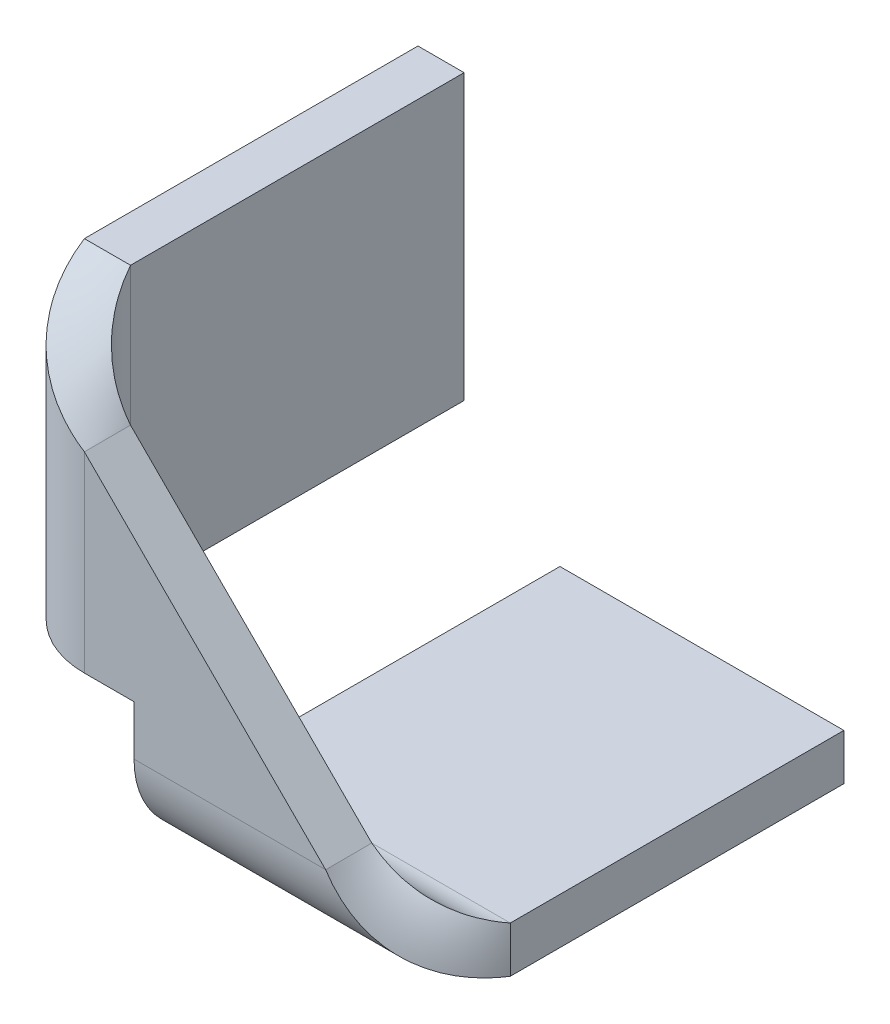
ISO-10303-21;
HEADER;
FILE_DESCRIPTION(('STEP AP214'),'2;1');
FILE_NAME('part.step','',(''),(''),'','','');
FILE_SCHEMA(('AUTOMOTIVE_DESIGN { 1 0 10303 214 1 1 1 1 }'));
ENDSEC;
DATA;
#1=APPLICATION_CONTEXT('core data for automotive mechanical design processes');
#2=APPLICATION_PROTOCOL_DEFINITION('international standard','automotive_design',2000,#1);
#3=PRODUCT_CONTEXT('',#1,'mechanical');
#4=PRODUCT('Part','Part','',(#3));
#5=PRODUCT_RELATED_PRODUCT_CATEGORY('part','',(#4));
#6=PRODUCT_DEFINITION_FORMATION('','',#4);
#7=PRODUCT_DEFINITION_CONTEXT('part definition',#1,'design');
#8=PRODUCT_DEFINITION('design','',#6,#7);
#9=PRODUCT_DEFINITION_SHAPE('','',#8);
#10=(LENGTH_UNIT() NAMED_UNIT(*) SI_UNIT(.MILLI.,.METRE.));
#11=(NAMED_UNIT(*) PLANE_ANGLE_UNIT() SI_UNIT($,.RADIAN.));
#12=(NAMED_UNIT(*) SI_UNIT($,.STERADIAN.) SOLID_ANGLE_UNIT());
#13=UNCERTAINTY_MEASURE_WITH_UNIT(LENGTH_MEASURE(1.E-05),#10,'distance_accuracy_value','');
#14=(GEOMETRIC_REPRESENTATION_CONTEXT(3) GLOBAL_UNCERTAINTY_ASSIGNED_CONTEXT((#13)) GLOBAL_UNIT_ASSIGNED_CONTEXT((#10,
#11,#12)) REPRESENTATION_CONTEXT('',''));
#15=CARTESIAN_POINT('',(0.,0.,0.));
#16=DIRECTION('',(0.,0.,1.));
#17=DIRECTION('',(1.,0.,0.));
#18=AXIS2_PLACEMENT_3D('',#15,#16,#17);
#19=CARTESIAN_POINT('',(9.19,0.,-0.8128));
#20=DIRECTION('',(0.707106781186547,0.707106781186548,0.));
#21=DIRECTION('',(-0.707106781186548,0.707106781186547,0.));
#22=AXIS2_PLACEMENT_3D('',#19,#20,#21);
#23=PLANE('',#22);
#24=DIRECTION('',(-0.707106781186548,0.707106781186547,0.));
#25=VECTOR('',#24,1.);
#26=CARTESIAN_POINT('',(9.19,0.,-0.8128));
#27=LINE('',#26,#25);
#28=CARTESIAN_POINT('',(7.5644,1.6256,-0.8128));
#29=VERTEX_POINT('',#28);
#30=CARTESIAN_POINT('',(3.31559999999999,5.87440000000001,-0.8128));
#31=VERTEX_POINT('',#30);
#32=EDGE_CURVE('E99',#29,#31,#27,.T.);
#33=ORIENTED_EDGE('',*,*,#32,.T.);
#34=DIRECTION('',(0.,0.,1.));
#35=VECTOR('',#34,1.);
#36=CARTESIAN_POINT('',(3.31559999999999,5.87440000000001,-0.8128));
#37=LINE('',#36,#35);
#38=CARTESIAN_POINT('',(3.31559999999999,5.87440000000001,0.));
#39=VERTEX_POINT('',#38);
#40=EDGE_CURVE('E244',#31,#39,#37,.T.);
#41=ORIENTED_EDGE('',*,*,#40,.T.);
#42=DIRECTION('',(-0.707106781186548,0.707106781186547,0.));
#43=VECTOR('',#42,1.);
#44=CARTESIAN_POINT('',(9.19,0.,0.));
#45=LINE('',#44,#43);
#46=CARTESIAN_POINT('',(7.5644,1.6256,0.));
#47=VERTEX_POINT('',#46);
#48=EDGE_CURVE('E345',#47,#39,#45,.T.);
#49=ORIENTED_EDGE('',*,*,#48,.F.);
#50=DIRECTION('',(0.,0.,1.));
#51=VECTOR('',#50,1.);
#52=CARTESIAN_POINT('',(7.5644,1.6256,-0.8128));
#53=LINE('',#52,#51);
#54=EDGE_CURVE('E353',#29,#47,#53,.T.);
#55=ORIENTED_EDGE('',*,*,#54,.F.);
#56=EDGE_LOOP('',(#33,#41,#49,#55));
#57=FACE_BOUND('',#56,.T.);
#58=ADVANCED_FACE('F90',(#57),#23,.T.);
#59=CARTESIAN_POINT('',(0.,0.,-0.8128));
#60=DIRECTION('',(0.,0.,1.));
#61=DIRECTION('',(1.,0.,0.));
#62=AXIS2_PLACEMENT_3D('',#59,#60,#61);
#63=PLANE('',#62);
#64=DIRECTION('',(0.,1.,0.));
#65=VECTOR('',#64,1.);
#66=CARTESIAN_POINT('',(3.31559999999999,7.5,-0.8128));
#67=LINE('',#66,#65);
#68=CARTESIAN_POINT('',(3.31559999999999,2.5,-0.8128));
#69=VERTEX_POINT('',#68);
#70=EDGE_CURVE('E251',#31,#69,#67,.F.);
#71=ORIENTED_EDGE('',*,*,#70,.F.);
#72=ORIENTED_EDGE('',*,*,#32,.F.);
#73=DIRECTION('',(-1.,0.,0.));
#74=VECTOR('',#73,1.);
#75=CARTESIAN_POINT('',(4.19,1.6256,-0.8128));
#76=LINE('',#75,#74);
#77=CARTESIAN_POINT('',(4.19,1.6256,-0.8128));
#78=VERTEX_POINT('',#77);
#79=EDGE_CURVE('E369',#78,#29,#76,.F.);
#80=ORIENTED_EDGE('',*,*,#79,.F.);
#81=DIRECTION('',(0.,-1.,0.));
#82=VECTOR('',#81,1.);
#83=CARTESIAN_POINT('',(4.19,0.,-0.8128));
#84=LINE('',#83,#82);
#85=CARTESIAN_POINT('',(4.19,2.5,-0.8128));
#86=VERTEX_POINT('',#85);
#87=EDGE_CURVE('E335',#86,#78,#84,.T.);
#88=ORIENTED_EDGE('',*,*,#87,.F.);
#89=DIRECTION('',(1.,0.,0.));
#90=VECTOR('',#89,1.);
#91=CARTESIAN_POINT('',(4.19,2.5,-0.8128));
#92=LINE('',#91,#90);
#93=EDGE_CURVE('E114',#69,#86,#92,.T.);
#94=ORIENTED_EDGE('',*,*,#93,.F.);
#95=EDGE_LOOP('',(#71,#72,#80,#88,#94));
#96=FACE_BOUND('',#95,.T.);
#97=ADVANCED_FACE('F312',(#96),#63,.F.);
#98=CARTESIAN_POINT('',(0.,0.,0.));
#99=DIRECTION('',(0.,0.,1.));
#100=DIRECTION('',(1.,0.,0.));
#101=AXIS2_PLACEMENT_3D('',#98,#99,#100);
#102=PLANE('',#101);
#103=ORIENTED_EDGE('',*,*,#48,.T.);
#104=DIRECTION('',(0.,1.,0.));
#105=VECTOR('',#104,1.);
#106=CARTESIAN_POINT('',(3.31559999999999,7.5,0.));
#107=LINE('',#106,#105);
#108=CARTESIAN_POINT('',(3.31559999999999,2.5,0.));
#109=VERTEX_POINT('',#108);
#110=EDGE_CURVE('E245',#39,#109,#107,.F.);
#111=ORIENTED_EDGE('',*,*,#110,.T.);
#112=DIRECTION('',(1.,0.,0.));
#113=VECTOR('',#112,1.);
#114=CARTESIAN_POINT('',(4.19,2.5,0.));
#115=LINE('',#114,#113);
#116=CARTESIAN_POINT('',(4.19,2.5,0.));
#117=VERTEX_POINT('',#116);
#118=EDGE_CURVE('E349',#109,#117,#115,.T.);
#119=ORIENTED_EDGE('',*,*,#118,.T.);
#120=DIRECTION('',(0.,-1.,0.));
#121=VECTOR('',#120,1.);
#122=CARTESIAN_POINT('',(4.19,0.,0.));
#123=LINE('',#122,#121);
#124=CARTESIAN_POINT('',(4.19,1.6256,0.));
#125=VERTEX_POINT('',#124);
#126=EDGE_CURVE('E352',#117,#125,#123,.T.);
#127=ORIENTED_EDGE('',*,*,#126,.T.);
#128=DIRECTION('',(-1.,0.,0.));
#129=VECTOR('',#128,1.);
#130=CARTESIAN_POINT('',(4.19,1.6256,0.));
#131=LINE('',#130,#129);
#132=EDGE_CURVE('E359',#125,#47,#131,.F.);
#133=ORIENTED_EDGE('',*,*,#132,.T.);
#134=EDGE_LOOP('',(#103,#111,#119,#127,#133));
#135=FACE_BOUND('',#134,.T.);
#136=ADVANCED_FACE('F318',(#135),#102,.T.);
#137=CARTESIAN_POINT('',(4.19,0.,-0.8128));
#138=DIRECTION('',(-1.,0.,0.));
#139=DIRECTION('',(0.,0.,1.));
#140=AXIS2_PLACEMENT_3D('',#137,#138,#139);
#141=PLANE('',#140);
#142=ORIENTED_EDGE('',*,*,#87,.T.);
#143=DIRECTION('',(0.,0.,1.));
#144=VECTOR('',#143,1.);
#145=CARTESIAN_POINT('',(4.19,1.6256,-0.8128));
#146=LINE('',#145,#144);
#147=EDGE_CURVE('E337',#78,#125,#146,.T.);
#148=ORIENTED_EDGE('',*,*,#147,.T.);
#149=ORIENTED_EDGE('',*,*,#126,.F.);
#150=DIRECTION('',(0.,0.,1.));
#151=VECTOR('',#150,1.);
#152=CARTESIAN_POINT('',(4.19,2.5,-0.8128));
#153=LINE('',#152,#151);
#154=EDGE_CURVE('E13',#86,#117,#153,.T.);
#155=ORIENTED_EDGE('',*,*,#154,.F.);
#156=EDGE_LOOP('',(#142,#148,#149,#155));
#157=FACE_BOUND('',#156,.T.);
#158=ADVANCED_FACE('F323',(#157),#141,.T.);
#159=CARTESIAN_POINT('',(4.19,2.5,-0.8128));
#160=DIRECTION('',(0.,-1.,0.));
#161=DIRECTION('',(0.,0.,-1.));
#162=AXIS2_PLACEMENT_3D('',#159,#160,#161);
#163=PLANE('',#162);
#164=DIRECTION('',(0.,0.,1.));
#165=VECTOR('',#164,1.);
#166=CARTESIAN_POINT('',(3.31559999999999,2.5,-0.8128));
#167=LINE('',#166,#165);
#168=EDGE_CURVE('E258',#69,#109,#167,.T.);
#169=ORIENTED_EDGE('',*,*,#168,.F.);
#170=ORIENTED_EDGE('',*,*,#93,.T.);
#171=ORIENTED_EDGE('',*,*,#154,.T.);
#172=ORIENTED_EDGE('',*,*,#118,.F.);
#173=EDGE_LOOP('',(#169,#170,#171,#172));
#174=FACE_BOUND('',#173,.T.);
#175=ADVANCED_FACE('F92',(#174),#163,.T.);
#176=CARTESIAN_POINT('',(7.5644,1.6256,0.00812800000000044));
#177=CARTESIAN_POINT('',(7.69988412758838,1.41171800414825,0.00812800000000044));
#178=CARTESIAN_POINT('',(7.83533333333333,1.19797515238148,-0.0343935668920254));
#179=CARTESIAN_POINT('',(8.10626666666667,0.80282357043661,-0.198070711326774));
#180=CARTESIAN_POINT('',(8.24173333333333,0.621597816268821,-0.319161888902504));
#181=CARTESIAN_POINT('',(8.51266666666667,0.319161888902505,-0.621597816268819));
#182=CARTESIAN_POINT('',(8.64813333333333,0.198070711326774,-0.802823570436608));
#183=CARTESIAN_POINT('',(8.91906666666667,0.0343935668920247,-1.19797515238148));
#184=CARTESIAN_POINT('',(9.05451587241162,-0.00812800000000207,-1.41171800414824));
#185=CARTESIAN_POINT('',(9.19,-0.00812800000000282,-1.62559999999999));
#186=CARTESIAN_POINT('',(7.5644,1.6256,0.));
#187=CARTESIAN_POINT('',(7.69988404696728,1.41278215668449,0.));
#188=CARTESIAN_POINT('',(7.83533333333333,1.20010263918555,-0.0423100168079855));
#189=CARTESIAN_POINT('',(8.10626666666667,0.806916985509065,-0.205172847091317));
#190=CARTESIAN_POINT('',(8.24173333333333,0.626592852008777,-0.325661580997516));
#191=CARTESIAN_POINT('',(8.51266666666667,0.325661580997518,-0.626592852008775));
#192=CARTESIAN_POINT('',(8.64813333333333,0.205172847091318,-0.806916985509062));
#193=CARTESIAN_POINT('',(8.91906666666667,0.0423100168079847,-1.20010263918555));
#194=CARTESIAN_POINT('',(9.05451595303273,0.,-1.41278215668449));
#195=CARTESIAN_POINT('',(9.19,0.,-1.62559999999999));
#196=CARTESIAN_POINT('',(7.5644,1.6256,-0.8128));
#197=CARTESIAN_POINT('',(7.69987598485685,1.51919741030897,-0.8128));
#198=CARTESIAN_POINT('',(7.83533333333333,1.41285131959278,-0.833955008403993));
#199=CARTESIAN_POINT('',(8.10626666666667,1.21625849275453,-0.915386423545658));
#200=CARTESIAN_POINT('',(8.24173333333333,1.12609642600439,-0.975630790498758));
#201=CARTESIAN_POINT('',(8.51266666666667,0.975630790498757,-1.12609642600439));
#202=CARTESIAN_POINT('',(8.64813333333333,0.915386423545657,-1.21625849275453));
#203=CARTESIAN_POINT('',(8.91906666666667,0.833955008403991,-1.41285131959277));
#204=CARTESIAN_POINT('',(9.05452401514315,0.812799999999998,-1.51919741030897));
#205=CARTESIAN_POINT('',(9.19,0.812799999999997,-1.6256));
#206=CARTESIAN_POINT('',(7.5644,1.6256,-0.82100928));
#207=CARTESIAN_POINT('',(7.69987590342953,1.52027220437058,-0.82100928));
#208=CARTESIAN_POINT('',(7.83533333333333,1.41500008126489,-0.841950622819112));
#209=CARTESIAN_POINT('',(8.10626666666667,1.22039284197771,-0.922559580667847));
#210=CARTESIAN_POINT('',(8.24173333333333,1.13114141210174,-0.982195479514721));
#211=CARTESIAN_POINT('',(8.51266666666667,0.98219547951472,-1.13114141210174));
#212=CARTESIAN_POINT('',(8.64813333333333,0.922559580667846,-1.22039284197771));
#213=CARTESIAN_POINT('',(8.91906666666667,0.841950622819111,-1.41500008126489));
#214=CARTESIAN_POINT('',(9.05452409657046,0.821009279999998,-1.52027220437057));
#215=CARTESIAN_POINT('',(9.19,0.821009279999997,-1.6256));
#216=B_SPLINE_SURFACE_WITH_KNOTS('',1,3,((#176,#177,#178,#179,#180,#181,#182,#183,#184,#185),
(#186,#187,#188,#189,#190,#191,#192,#193,#194,#195),(#196,#197,#198,#199,#200,#201,#202,#203,
#204,#205),(#206,#207,#208,#209,#210,#211,#212,#213,#214,#215)),.UNSPECIFIED.,.F.,.F.,.F.,(2,1,
1,2),(4,2,2,2,4),(-0.01,0.,1.,1.0101),(0.,0.25,0.5,0.75,1.),.UNSPECIFIED.);
#217=DIRECTION('',(0.,1.,0.));
#218=VECTOR('',#217,1.);
#219=CARTESIAN_POINT('',(9.19,0.,-1.62559999999999));
#220=LINE('',#219,#218);
#221=CARTESIAN_POINT('',(9.19,0.812799999999997,-1.6256));
#222=VERTEX_POINT('',#221);
#223=CARTESIAN_POINT('',(9.19,0.,-1.62559999999999));
#224=VERTEX_POINT('',#223);
#225=EDGE_CURVE('E262',#222,#224,#220,.F.);
#226=CARTESIAN_POINT('',(7.5644,1.6256,-0.8128));
#227=CARTESIAN_POINT('',(7.61166338937327,1.58848120839972,-0.812783326548156));
#228=CARTESIAN_POINT('',(7.65892337579554,1.55136456050474,-0.815342088576877));
#229=CARTESIAN_POINT('',(7.75343654696838,1.47782796806991,-0.825488995568115));
#230=CARTESIAN_POINT('',(7.80068973184159,1.44140793854422,-0.833076522954139));
#231=CARTESIAN_POINT('',(7.89504357068617,1.3700665090968,-0.853126094852786));
#232=CARTESIAN_POINT('',(7.94214420868173,1.3351405232327,-0.865571825580327));
#233=CARTESIAN_POINT('',(8.03633131067102,1.2673124589663,-0.895090463806872));
#234=CARTESIAN_POINT('',(8.08341777514003,1.2344103028119,-0.912163193408059));
#235=CARTESIAN_POINT('',(8.22518100772179,1.1393269164824,-0.970091485619775));
#236=CARTESIAN_POINT('',(8.31992405705843,1.08111150781891,-1.0175592425017));
#237=CARTESIAN_POINT('',(8.50938057480472,0.979779348495315,-1.12650955307725));
#238=CARTESIAN_POINT('',(8.60409404128916,0.936657056731869,-1.18798694972732));
#239=CARTESIAN_POINT('',(8.73961465556353,0.887991765317754,-1.28264537286954));
#240=CARTESIAN_POINT('',(8.78050287628679,0.875011954038179,-1.312079450878));
#241=CARTESIAN_POINT('',(8.86228563928151,0.852617646202696,-1.37227965665929));
#242=CARTESIAN_POINT('',(8.9031801807327,0.843202850047989,-1.40304567225572));
#243=CARTESIAN_POINT('',(8.98505789471957,0.828064775922369,-1.46554609840697));
#244=CARTESIAN_POINT('',(9.02604105892291,0.822349879763522,-1.49728253837125));
#245=CARTESIAN_POINT('',(9.10801521021243,0.814712542118944,-1.5612124009258));
#246=CARTESIAN_POINT('',(9.14900619745971,0.81279073564452,-1.59340589912494));
#247=CARTESIAN_POINT('',(9.19,0.812799999999997,-1.6256));
#248=B_SPLINE_CURVE_WITH_KNOTS('',3,(#226,#227,#228,#229,#230,#231,#232,#233,#234,#235,#236,
#237,#238,#239,#240,#241,#242,#243,#244,#245,#246,#247),.UNSPECIFIED.,.F.,.F.,(4,2,2,2,2,2,2,2,
2,2,4),(0.,0.180229608899156,0.360437088121845,0.540044567704543,0.719645142758519,
1.08051758874071,1.44125740909242,1.59722557168485,1.75318062402431,1.90948775446224,
2.06582105047687),.UNSPECIFIED.);
#249=EDGE_CURVE('E375',#29,#222,#248,.T.);
#250=CARTESIAN_POINT('',(7.5644,1.6256,0.));
#251=CARTESIAN_POINT('',(7.59891739987242,1.57138347869436,8.95556154438632E-06));
#252=CARTESIAN_POINT('',(7.63343228780956,1.51716926247434,-0.00271219154217898));
#253=CARTESIAN_POINT('',(7.7024583729108,1.40928495325419,-0.0135470645411389));
#254=CARTESIAN_POINT('',(7.73696957016728,1.35561482405513,-0.0216604292615984));
#255=CARTESIAN_POINT('',(7.80597214396022,1.24938479714437,-0.0432052319686749));
#256=CARTESIAN_POINT('',(7.84046351904778,1.19682421093681,-0.0566332634181364));
#257=CARTESIAN_POINT('',(7.90943844013843,1.09331967631916,-0.0886574352658036));
#258=CARTESIAN_POINT('',(7.94392198626144,1.04237570122001,-0.107253490294213));
#259=CARTESIAN_POINT('',(8.04747005947011,0.892575944085228,-0.170613842791386));
#260=CARTESIAN_POINT('',(8.11658613850283,0.796824347285647,-0.22293560465262));
#261=CARTESIAN_POINT('',(8.25474785675975,0.617743836128655,-0.345526055647164));
#262=CARTESIAN_POINT('',(8.32379351391378,0.534408811848525,-0.41578587136262));
#263=CARTESIAN_POINT('',(8.46189788431638,0.383354102768654,-0.571485506163266));
#264=CARTESIAN_POINT('',(8.53095659806655,0.315635255670388,-0.656926139160766));
#265=CARTESIAN_POINT('',(8.66909760323248,0.198520674238566,-0.839596907783758));
#266=CARTESIAN_POINT('',(8.73817989313652,0.149132217659907,-0.936831705786897));
#267=CARTESIAN_POINT('',(8.87107136539665,0.073684925791739,-1.13146143486428));
#268=CARTESIAN_POINT('',(8.9348798222591,0.0461309104563841,-1.22827555220706));
#269=CARTESIAN_POINT('',(9.03053708257213,0.0184966380512806,-1.37597367805506));
#270=CARTESIAN_POINT('',(9.06242410667917,0.011567982188591,-1.42563600082758));
#271=CARTESIAN_POINT('',(9.12620278007468,0.00231853282787797,-1.52539264835346));
#272=CARTESIAN_POINT('',(9.15809442948879,-1.75898305385909E-06,-1.5754870195454));
#273=CARTESIAN_POINT('',(9.19,0.,-1.62559999999999));
#274=B_SPLINE_CURVE_WITH_KNOTS('',3,(#250,#251,#252,#253,#254,#255,#256,#257,#258,#259,#260,
#261,#262,#263,#264,#265,#266,#267,#268,#269,#270,#271,#272,#273),.UNSPECIFIED.,.F.,.F.,(4,2,2,
2,2,2,2,2,2,2,2,4),(0.,0.192752461267689,0.385492013132063,0.57810822445074,0.770721254160585,
1.1562039825754,1.54149639244941,1.92680946582988,2.3122753576623,2.66826538492096,
2.84637793132977,3.02450986680323),.UNSPECIFIED.);
#275=EDGE_CURVE('E106',#47,#224,#274,.T.);
#276=ORIENTED_EDGE('',*,*,#225,.F.);
#277=ORIENTED_EDGE('',*,*,#249,.F.);
#278=ORIENTED_EDGE('',*,*,#54,.T.);
#279=ORIENTED_EDGE('',*,*,#275,.T.);
#280=EDGE_LOOP('',(#276,#277,#278,#279));
#281=FACE_BOUND('',#280,.T.);
#282=ADVANCED_FACE('F329',(#281),#216,.F.);
#283=CARTESIAN_POINT('',(4.19,1.6256,-1.6256));
#284=DIRECTION('',(1.,0.,0.));
#285=DIRECTION('',(0.,0.,-1.));
#286=AXIS2_PLACEMENT_3D('',#283,#284,#285);
#287=PLANE('',#286);
#288=CARTESIAN_POINT('',(4.19,1.6256,-1.6256));
#289=DIRECTION('',(-1.,0.,0.));
#290=DIRECTION('',(0.,0.,1.));
#291=AXIS2_PLACEMENT_3D('',#288,#289,#290);
#292=CIRCLE('',#291,0.8128);
#293=CARTESIAN_POINT('',(4.19,0.812799999999997,-1.6256));
#294=VERTEX_POINT('',#293);
#295=EDGE_CURVE('E376',#294,#78,#292,.T.);
#296=ORIENTED_EDGE('',*,*,#295,.F.);
#297=DIRECTION('',(0.,1.,0.));
#298=VECTOR('',#297,1.);
#299=CARTESIAN_POINT('',(4.19,0.812799999999997,-1.6256));
#300=LINE('',#299,#298);
#301=CARTESIAN_POINT('',(4.19,0.,-1.62559999999999));
#302=VERTEX_POINT('',#301);
#303=EDGE_CURVE('E430',#294,#302,#300,.F.);
#304=ORIENTED_EDGE('',*,*,#303,.T.);
#305=CARTESIAN_POINT('',(4.19,1.6256,-1.6256));
#306=DIRECTION('',(-1.,0.,0.));
#307=DIRECTION('',(0.,0.,1.));
#308=AXIS2_PLACEMENT_3D('',#305,#306,#307);
#309=CIRCLE('',#308,1.6256);
#310=EDGE_CURVE('E380',#302,#125,#309,.T.);
#311=ORIENTED_EDGE('',*,*,#310,.T.);
#312=ORIENTED_EDGE('',*,*,#147,.F.);
#313=EDGE_LOOP('',(#296,#304,#311,#312));
#314=FACE_BOUND('',#313,.T.);
#315=ADVANCED_FACE('F412',(#314),#287,.F.);
#316=CARTESIAN_POINT('',(4.19,1.6256,-1.6256));
#317=DIRECTION('',(-1.,0.,0.));
#318=DIRECTION('',(0.,-1.,0.));
#319=AXIS2_PLACEMENT_3D('',#316,#317,#318);
#320=CYLINDRICAL_SURFACE('',#319,1.6256);
#321=ORIENTED_EDGE('',*,*,#132,.F.);
#322=ORIENTED_EDGE('',*,*,#310,.F.);
#323=DIRECTION('',(-1.,0.,0.));
#324=VECTOR('',#323,1.);
#325=CARTESIAN_POINT('',(9.19,0.,-1.62559999999999));
#326=LINE('',#325,#324);
#327=EDGE_CURVE('E441',#302,#224,#326,.F.);
#328=ORIENTED_EDGE('',*,*,#327,.T.);
#329=ORIENTED_EDGE('',*,*,#275,.F.);
#330=EDGE_LOOP('',(#321,#322,#328,#329));
#331=FACE_BOUND('',#330,.T.);
#332=ADVANCED_FACE('F407',(#331),#320,.T.);
#333=CARTESIAN_POINT('',(4.19,1.6256,-1.6256));
#334=DIRECTION('',(-1.,0.,0.));
#335=DIRECTION('',(0.,-1.,0.));
#336=AXIS2_PLACEMENT_3D('',#333,#334,#335);
#337=CYLINDRICAL_SURFACE('',#336,0.8128);
#338=ORIENTED_EDGE('',*,*,#79,.T.);
#339=ORIENTED_EDGE('',*,*,#249,.T.);
#340=DIRECTION('',(-1.,0.,0.));
#341=VECTOR('',#340,1.);
#342=CARTESIAN_POINT('',(9.19,0.812799999999997,-1.6256));
#343=LINE('',#342,#341);
#344=EDGE_CURVE('E442',#222,#294,#343,.T.);
#345=ORIENTED_EDGE('',*,*,#344,.T.);
#346=ORIENTED_EDGE('',*,*,#295,.T.);
#347=EDGE_LOOP('',(#338,#339,#345,#346));
#348=FACE_BOUND('',#347,.T.);
#349=ADVANCED_FACE('F411',(#348),#337,.F.);
#350=CARTESIAN_POINT('',(4.19,0.,-7.5));
#351=DIRECTION('',(1.,0.,0.));
#352=DIRECTION('',(0.,0.,-1.));
#353=AXIS2_PLACEMENT_3D('',#350,#351,#352);
#354=PLANE('',#353);
#355=ORIENTED_EDGE('',*,*,#303,.F.);
#356=DIRECTION('',(0.,0.,1.));
#357=VECTOR('',#356,1.);
#358=CARTESIAN_POINT('',(4.19,0.812799999999977,-7.5));
#359=LINE('',#358,#357);
#360=CARTESIAN_POINT('',(4.19,0.812799999999977,-7.5));
#361=VERTEX_POINT('',#360);
#362=EDGE_CURVE('E433',#294,#361,#359,.F.);
#363=ORIENTED_EDGE('',*,*,#362,.T.);
#364=DIRECTION('',(0.,1.,0.));
#365=VECTOR('',#364,1.);
#366=CARTESIAN_POINT('',(4.19,0.,-7.5));
#367=LINE('',#366,#365);
#368=CARTESIAN_POINT('',(4.19,0.,-7.5));
#369=VERTEX_POINT('',#368);
#370=EDGE_CURVE('E381',#369,#361,#367,.T.);
#371=ORIENTED_EDGE('',*,*,#370,.F.);
#372=DIRECTION('',(0.,0.,-1.));
#373=VECTOR('',#372,1.);
#374=CARTESIAN_POINT('',(4.19,0.,0.));
#375=LINE('',#374,#373);
#376=EDGE_CURVE('E435',#302,#369,#375,.T.);
#377=ORIENTED_EDGE('',*,*,#376,.F.);
#378=EDGE_LOOP('',(#355,#363,#371,#377));
#379=FACE_BOUND('',#378,.T.);
#380=ADVANCED_FACE('F413',(#379),#354,.F.);
#381=CARTESIAN_POINT('',(9.19,0.,-0.812799999999997));
#382=DIRECTION('',(-1.,0.,0.));
#383=DIRECTION('',(0.,0.,1.));
#384=AXIS2_PLACEMENT_3D('',#381,#382,#383);
#385=PLANE('',#384);
#386=ORIENTED_EDGE('',*,*,#225,.T.);
#387=DIRECTION('',(0.,0.,1.));
#388=VECTOR('',#387,1.);
#389=CARTESIAN_POINT('',(9.19,0.,0.));
#390=LINE('',#389,#388);
#391=CARTESIAN_POINT('',(9.19,0.,-7.5));
#392=VERTEX_POINT('',#391);
#393=EDGE_CURVE('E469',#392,#224,#390,.T.);
#394=ORIENTED_EDGE('',*,*,#393,.F.);
#395=DIRECTION('',(0.,1.,0.));
#396=VECTOR('',#395,1.);
#397=CARTESIAN_POINT('',(9.19,0.,-7.5));
#398=LINE('',#397,#396);
#399=CARTESIAN_POINT('',(9.19,0.812799999999977,-7.5));
#400=VERTEX_POINT('',#399);
#401=EDGE_CURVE('E474',#392,#400,#398,.T.);
#402=ORIENTED_EDGE('',*,*,#401,.T.);
#403=DIRECTION('',(0.,0.,-1.));
#404=VECTOR('',#403,1.);
#405=CARTESIAN_POINT('',(9.19,0.8128,-0.8128));
#406=LINE('',#405,#404);
#407=EDGE_CURVE('E454',#400,#222,#406,.F.);
#408=ORIENTED_EDGE('',*,*,#407,.T.);
#409=EDGE_LOOP('',(#386,#394,#402,#408));
#410=FACE_BOUND('',#409,.T.);
#411=ADVANCED_FACE('F419',(#410),#385,.F.);
#412=CARTESIAN_POINT('',(0.,0.,0.));
#413=DIRECTION('',(0.,1.,0.));
#414=DIRECTION('',(0.,0.,1.));
#415=AXIS2_PLACEMENT_3D('',#412,#413,#414);
#416=PLANE('',#415);
#417=ORIENTED_EDGE('',*,*,#327,.F.);
#418=ORIENTED_EDGE('',*,*,#376,.T.);
#419=DIRECTION('',(1.,0.,0.));
#420=VECTOR('',#419,1.);
#421=CARTESIAN_POINT('',(0.,0.,-7.5));
#422=LINE('',#421,#420);
#423=EDGE_CURVE('E471',#369,#392,#422,.T.);
#424=ORIENTED_EDGE('',*,*,#423,.T.);
#425=ORIENTED_EDGE('',*,*,#393,.T.);
#426=EDGE_LOOP('',(#417,#418,#424,#425));
#427=FACE_BOUND('',#426,.T.);
#428=ADVANCED_FACE('F424',(#427),#416,.F.);
#429=CARTESIAN_POINT('',(0.,0.812800000000003,0.));
#430=DIRECTION('',(0.,1.,0.));
#431=DIRECTION('',(0.,0.,1.));
#432=AXIS2_PLACEMENT_3D('',#429,#430,#431);
#433=PLANE('',#432);
#434=ORIENTED_EDGE('',*,*,#362,.F.);
#435=ORIENTED_EDGE('',*,*,#344,.F.);
#436=ORIENTED_EDGE('',*,*,#407,.F.);
#437=DIRECTION('',(-1.,0.,0.));
#438=VECTOR('',#437,1.);
#439=CARTESIAN_POINT('',(9.19,0.812799999999977,-7.5));
#440=LINE('',#439,#438);
#441=EDGE_CURVE('E448',#361,#400,#440,.F.);
#442=ORIENTED_EDGE('',*,*,#441,.F.);
#443=EDGE_LOOP('',(#434,#435,#436,#442));
#444=FACE_BOUND('',#443,.T.);
#445=ADVANCED_FACE('F308',(#444),#433,.T.);
#446=CARTESIAN_POINT('',(9.19,0.,-7.5));
#447=DIRECTION('',(0.,0.,1.));
#448=DIRECTION('',(0.,-1.,0.));
#449=AXIS2_PLACEMENT_3D('',#446,#447,#448);
#450=PLANE('',#449);
#451=ORIENTED_EDGE('',*,*,#441,.T.);
#452=ORIENTED_EDGE('',*,*,#401,.F.);
#453=ORIENTED_EDGE('',*,*,#423,.F.);
#454=ORIENTED_EDGE('',*,*,#370,.T.);
#455=EDGE_LOOP('',(#451,#452,#453,#454));
#456=FACE_BOUND('',#455,.T.);
#457=ADVANCED_FACE('F300',(#456),#450,.F.);
#458=CARTESIAN_POINT('',(3.31559999999999,2.5,-1.6256));
#459=DIRECTION('',(0.,-1.,0.));
#460=DIRECTION('',(1.,0.,0.));
#461=AXIS2_PLACEMENT_3D('',#458,#459,#460);
#462=PLANE('',#461);
#463=DIRECTION('',(1.,0.,0.));
#464=VECTOR('',#463,1.);
#465=CARTESIAN_POINT('',(1.68999999999999,2.5,-1.62559999999999));
#466=LINE('',#465,#464);
#467=CARTESIAN_POINT('',(2.50279999999999,2.5,-1.6256));
#468=VERTEX_POINT('',#467);
#469=CARTESIAN_POINT('',(1.68999999999999,2.5,-1.62559999999999));
#470=VERTEX_POINT('',#469);
#471=EDGE_CURVE('E213',#468,#470,#466,.F.);
#472=ORIENTED_EDGE('',*,*,#471,.F.);
#473=CARTESIAN_POINT('',(3.31559999999999,2.5,-1.6256));
#474=DIRECTION('',(0.,1.,0.));
#475=DIRECTION('',(-1.,0.,0.));
#476=AXIS2_PLACEMENT_3D('',#473,#474,#475);
#477=CIRCLE('',#476,0.8128);
#478=EDGE_CURVE('E246',#69,#468,#477,.F.);
#479=ORIENTED_EDGE('',*,*,#478,.F.);
#480=ORIENTED_EDGE('',*,*,#168,.T.);
#481=CARTESIAN_POINT('',(3.31559999999999,2.5,-1.6256));
#482=DIRECTION('',(0.,1.,0.));
#483=DIRECTION('',(-1.,0.,0.));
#484=AXIS2_PLACEMENT_3D('',#481,#482,#483);
#485=CIRCLE('',#484,1.6256);
#486=EDGE_CURVE('E240',#109,#470,#485,.F.);
#487=ORIENTED_EDGE('',*,*,#486,.T.);
#488=EDGE_LOOP('',(#472,#479,#480,#487));
#489=FACE_BOUND('',#488,.T.);
#490=ADVANCED_FACE('F298',(#489),#462,.T.);
#491=CARTESIAN_POINT('',(1.68187199999999,7.5,-1.62559999999999));
#492=CARTESIAN_POINT('',(1.68187199999999,7.36451587241162,-1.41171800414825));
#493=CARTESIAN_POINT('',(1.72439356689201,7.22906666666667,-1.19797515238148));
#494=CARTESIAN_POINT('',(1.88807071132676,6.95813333333334,-0.802823570436608));
#495=CARTESIAN_POINT('',(2.00916188890249,6.82266666666667,-0.621597816268819));
#496=CARTESIAN_POINT('',(2.31159781626881,6.55173333333334,-0.319161888902504));
#497=CARTESIAN_POINT('',(2.4928235704366,6.41626666666667,-0.198070711326774));
#498=CARTESIAN_POINT('',(2.88797515238147,6.14533333333334,-0.0343935668920257));
#499=CARTESIAN_POINT('',(3.10171800414824,6.00988412758839,0.0081280000000003));
#500=CARTESIAN_POINT('',(3.31559999999999,5.87440000000001,0.00812800000000011));
#501=CARTESIAN_POINT('',(1.68999999999999,7.5,-1.62559999999999));
#502=CARTESIAN_POINT('',(1.68999999999999,7.36451595303272,-1.41278215668449));
#503=CARTESIAN_POINT('',(1.73231001680797,7.22906666666667,-1.20010263918555));
#504=CARTESIAN_POINT('',(1.89517284709131,6.95813333333334,-0.806916985509062));
#505=CARTESIAN_POINT('',(2.01566158099751,6.82266666666667,-0.626592852008775));
#506=CARTESIAN_POINT('',(2.31659285200877,6.55173333333334,-0.325661580997517));
#507=CARTESIAN_POINT('',(2.49691698550905,6.41626666666667,-0.205172847091317));
#508=CARTESIAN_POINT('',(2.89010263918554,6.14533333333334,-0.0423100168079858));
#509=CARTESIAN_POINT('',(3.10278215668448,6.00988404696728,0.));
#510=CARTESIAN_POINT('',(3.31559999999999,5.87440000000001,0.));
#511=CARTESIAN_POINT('',(2.50279999999999,7.5,-1.6256));
#512=CARTESIAN_POINT('',(2.50279999999999,7.36452401514315,-1.51919741030897));
#513=CARTESIAN_POINT('',(2.52395500840398,7.22906666666667,-1.41285131959277));
#514=CARTESIAN_POINT('',(2.60538642354565,6.95813333333334,-1.21625849275453));
#515=CARTESIAN_POINT('',(2.66563079049875,6.82266666666667,-1.12609642600439));
#516=CARTESIAN_POINT('',(2.81609642600438,6.55173333333334,-0.975630790498758));
#517=CARTESIAN_POINT('',(2.90625849275452,6.41626666666667,-0.915386423545659));
#518=CARTESIAN_POINT('',(3.10285131959276,6.14533333333334,-0.833955008403993));
#519=CARTESIAN_POINT('',(3.20919741030895,6.00987598485686,-0.8128));
#520=CARTESIAN_POINT('',(3.31559999999999,5.87440000000001,-0.8128));
#521=CARTESIAN_POINT('',(2.51100927999999,7.5,-1.6256));
#522=CARTESIAN_POINT('',(2.51100927999999,7.36452409657047,-1.52027220437058));
#523=CARTESIAN_POINT('',(2.5319506228191,7.22906666666667,-1.41500008126489));
#524=CARTESIAN_POINT('',(2.61255958066784,6.95813333333334,-1.22039284197771));
#525=CARTESIAN_POINT('',(2.67219547951471,6.82266666666667,-1.13114141210174));
#526=CARTESIAN_POINT('',(2.82114141210173,6.55173333333334,-0.982195479514721));
#527=CARTESIAN_POINT('',(2.9103928419777,6.41626666666667,-0.922559580667847));
#528=CARTESIAN_POINT('',(3.10500008126488,6.14533333333334,-0.841950622819112));
#529=CARTESIAN_POINT('',(3.21027220437056,6.00987590342954,-0.82100928));
#530=CARTESIAN_POINT('',(3.31559999999999,5.87440000000001,-0.82100928));
#531=B_SPLINE_SURFACE_WITH_KNOTS('',1,3,((#491,#492,#493,#494,#495,#496,#497,#498,#499,#500),
(#501,#502,#503,#504,#505,#506,#507,#508,#509,#510),(#511,#512,#513,#514,#515,#516,#517,#518,
#519,#520),(#521,#522,#523,#524,#525,#526,#527,#528,#529,#530)),.UNSPECIFIED.,.F.,.F.,.F.,(2,1,
1,2),(4,2,2,2,4),(-0.01,0.,1.,1.0101),(0.,0.25,0.5,0.75,1.),.UNSPECIFIED.);
#532=CARTESIAN_POINT('',(2.50279999999999,7.5,-1.6256));
#533=CARTESIAN_POINT('',(2.50278332654814,7.45273661062673,-1.58848120839972));
#534=CARTESIAN_POINT('',(2.50534208857686,7.40547662420446,-1.55136456050474));
#535=CARTESIAN_POINT('',(2.5154889955681,7.31096345303162,-1.47782796806991));
#536=CARTESIAN_POINT('',(2.52307652295413,7.26371026815841,-1.44140793854422));
#537=CARTESIAN_POINT('',(2.54312609485277,7.16935642931383,-1.3700665090968));
#538=CARTESIAN_POINT('',(2.55557182558031,7.12225579131827,-1.3351405232327));
#539=CARTESIAN_POINT('',(2.58509046380686,7.02806868932899,-1.2673124589663));
#540=CARTESIAN_POINT('',(2.60216319340805,6.98098222485998,-1.2344103028119));
#541=CARTESIAN_POINT('',(2.66009148561976,6.83921899227821,-1.1393269164824));
#542=CARTESIAN_POINT('',(2.70755924250168,6.74447594294158,-1.08111150781891));
#543=CARTESIAN_POINT('',(2.81650955307724,6.55501942519529,-0.979779348495319));
#544=CARTESIAN_POINT('',(2.87798694972731,6.46030595871085,-0.936657056731874));
#545=CARTESIAN_POINT('',(2.97264537286953,6.32478534443648,-0.887991765317757));
#546=CARTESIAN_POINT('',(3.00207945087799,6.28389712371323,-0.875011954038182));
#547=CARTESIAN_POINT('',(3.06227965665927,6.2021143607185,-0.852617646202698));
#548=CARTESIAN_POINT('',(3.09304567225571,6.1612198192673,-0.843202850047991));
#549=CARTESIAN_POINT('',(3.15554609840696,6.07934210528044,-0.828064775922372));
#550=CARTESIAN_POINT('',(3.18728253837124,6.0383589410771,-0.822349879763525));
#551=CARTESIAN_POINT('',(3.25121240092579,5.95638478978758,-0.814712542118946));
#552=CARTESIAN_POINT('',(3.28340589912493,5.9153938025403,-0.812790735644522));
#553=CARTESIAN_POINT('',(3.31559999999999,5.87440000000001,-0.8128));
#554=B_SPLINE_CURVE_WITH_KNOTS('',3,(#532,#533,#534,#535,#536,#537,#538,#539,#540,#541,#542,
#543,#544,#545,#546,#547,#548,#549,#550,#551,#552,#553),.UNSPECIFIED.,.F.,.F.,(4,2,2,2,2,2,2,2,
2,2,4),(0.,0.180229608899155,0.360437088121842,0.540044567704538,0.719645142758512,
1.0805175887407,1.44125740909241,1.59722557168484,1.7531806240243,1.90948775446223,
2.06582105047687),.UNSPECIFIED.);
#555=CARTESIAN_POINT('',(2.50279999999999,7.5,-1.6256));
#556=VERTEX_POINT('',#555);
#557=EDGE_CURVE('E257',#556,#31,#554,.T.);
#558=DIRECTION('',(1.,0.,0.));
#559=VECTOR('',#558,1.);
#560=CARTESIAN_POINT('',(2.50279999999999,7.5,-1.6256));
#561=LINE('',#560,#559);
#562=CARTESIAN_POINT('',(1.68999999999999,7.5,-1.62559999999999));
#563=VERTEX_POINT('',#562);
#564=EDGE_CURVE('E231',#556,#563,#561,.F.);
#565=CARTESIAN_POINT('',(1.68999999999999,7.5,-1.62559999999999));
#566=CARTESIAN_POINT('',(1.68999104443844,7.46548260012758,-1.57138347869435));
#567=CARTESIAN_POINT('',(1.69271219154217,7.43096771219044,-1.51716926247434));
#568=CARTESIAN_POINT('',(1.70354706454113,7.3619416270892,-1.40928495325419));
#569=CARTESIAN_POINT('',(1.71166042926159,7.32743042983272,-1.35561482405513));
#570=CARTESIAN_POINT('',(1.73320523196866,7.25842785603978,-1.24938479714437));
#571=CARTESIAN_POINT('',(1.74663326341812,7.22393648095223,-1.19682421093681));
#572=CARTESIAN_POINT('',(1.77865743526579,7.15496155986157,-1.09331967631916));
#573=CARTESIAN_POINT('',(1.7972534902942,7.12047801373856,-1.04237570122001));
#574=CARTESIAN_POINT('',(1.86061384279138,7.01692994052989,-0.892575944085227));
#575=CARTESIAN_POINT('',(1.91293560465261,6.94781386149717,-0.796824347285645));
#576=CARTESIAN_POINT('',(2.03552605564715,6.80965214324025,-0.617743836128652));
#577=CARTESIAN_POINT('',(2.10578587136261,6.74060648608622,-0.534408811848523));
#578=CARTESIAN_POINT('',(2.26148550616326,6.60250211568363,-0.383354102768653));
#579=CARTESIAN_POINT('',(2.34692613916076,6.53344340193346,-0.315635255670387));
#580=CARTESIAN_POINT('',(2.52959690778375,6.39530239676753,-0.198520674238567));
#581=CARTESIAN_POINT('',(2.62683170578688,6.32622010686349,-0.149132217659909));
#582=CARTESIAN_POINT('',(2.82146143486427,6.19332863460336,-0.0736849257917412));
#583=CARTESIAN_POINT('',(2.91827555220705,6.12952017774091,-0.0461309104563856));
#584=CARTESIAN_POINT('',(3.06597367805505,6.03386291742787,-0.0184966380512824));
#585=CARTESIAN_POINT('',(3.11563600082757,6.00197589332084,-0.0115679821885931));
#586=CARTESIAN_POINT('',(3.21539264835345,5.93819721992532,-0.00231853282788049));
#587=CARTESIAN_POINT('',(3.26548701954539,5.90630557051122,1.75898305114611E-06));
#588=CARTESIAN_POINT('',(3.31559999999999,5.87440000000001,0.));
#589=B_SPLINE_CURVE_WITH_KNOTS('',3,(#565,#566,#567,#568,#569,#570,#571,#572,#573,#574,#575,
#576,#577,#578,#579,#580,#581,#582,#583,#584,#585,#586,#587,#588),.UNSPECIFIED.,.F.,.F.,(4,2,2,
2,2,2,2,2,2,2,2,4),(0.,0.19275246126769,0.385492013132062,0.578108224450738,0.770721254160582,
1.1562039825754,1.54149639244941,1.92680946582987,2.3122753576623,2.66826538492095,
2.84637793132976,3.02450986680323),.UNSPECIFIED.);
#590=EDGE_CURVE('E250',#563,#39,#589,.T.);
#591=ORIENTED_EDGE('',*,*,#557,.F.);
#592=ORIENTED_EDGE('',*,*,#564,.T.);
#593=ORIENTED_EDGE('',*,*,#590,.T.);
#594=ORIENTED_EDGE('',*,*,#40,.F.);
#595=EDGE_LOOP('',(#591,#592,#593,#594));
#596=FACE_BOUND('',#595,.T.);
#597=ADVANCED_FACE('F281',(#596),#531,.F.);
#598=CARTESIAN_POINT('',(3.31559999999999,7.5,-1.6256));
#599=DIRECTION('',(0.,1.,0.));
#600=DIRECTION('',(-1.,0.,0.));
#601=AXIS2_PLACEMENT_3D('',#598,#599,#600);
#602=CYLINDRICAL_SURFACE('',#601,1.6256);
#603=ORIENTED_EDGE('',*,*,#110,.F.);
#604=ORIENTED_EDGE('',*,*,#590,.F.);
#605=DIRECTION('',(0.,1.,0.));
#606=VECTOR('',#605,1.);
#607=CARTESIAN_POINT('',(1.68999999999999,2.5,-1.62559999999999));
#608=LINE('',#607,#606);
#609=EDGE_CURVE('E228',#563,#470,#608,.F.);
#610=ORIENTED_EDGE('',*,*,#609,.T.);
#611=ORIENTED_EDGE('',*,*,#486,.F.);
#612=EDGE_LOOP('',(#603,#604,#610,#611));
#613=FACE_BOUND('',#612,.T.);
#614=ADVANCED_FACE('F287',(#613),#602,.T.);
#615=CARTESIAN_POINT('',(3.31559999999999,7.5,-1.6256));
#616=DIRECTION('',(0.,1.,0.));
#617=DIRECTION('',(-1.,0.,0.));
#618=AXIS2_PLACEMENT_3D('',#615,#616,#617);
#619=CYLINDRICAL_SURFACE('',#618,0.8128);
#620=ORIENTED_EDGE('',*,*,#70,.T.);
#621=ORIENTED_EDGE('',*,*,#478,.T.);
#622=DIRECTION('',(0.,1.,0.));
#623=VECTOR('',#622,1.);
#624=CARTESIAN_POINT('',(2.50279999999999,2.5,-1.6256));
#625=LINE('',#624,#623);
#626=EDGE_CURVE('E235',#468,#556,#625,.T.);
#627=ORIENTED_EDGE('',*,*,#626,.T.);
#628=ORIENTED_EDGE('',*,*,#557,.T.);
#629=EDGE_LOOP('',(#620,#621,#627,#628));
#630=FACE_BOUND('',#629,.T.);
#631=ADVANCED_FACE('F291',(#630),#619,.F.);
#632=CARTESIAN_POINT('',(1.68999999999997,7.5,-7.5));
#633=DIRECTION('',(0.,-1.,0.));
#634=DIRECTION('',(1.,0.,0.));
#635=AXIS2_PLACEMENT_3D('',#632,#633,#634);
#636=PLANE('',#635);
#637=ORIENTED_EDGE('',*,*,#564,.F.);
#638=DIRECTION('',(0.,0.,1.));
#639=VECTOR('',#638,1.);
#640=CARTESIAN_POINT('',(2.50279999999997,7.5,-7.5));
#641=LINE('',#640,#639);
#642=CARTESIAN_POINT('',(2.50279999999997,7.5,-7.5));
#643=VERTEX_POINT('',#642);
#644=EDGE_CURVE('E225',#556,#643,#641,.F.);
#645=ORIENTED_EDGE('',*,*,#644,.T.);
#646=DIRECTION('',(1.,0.,0.));
#647=VECTOR('',#646,1.);
#648=CARTESIAN_POINT('',(1.68999999999997,7.5,-7.5));
#649=LINE('',#648,#647);
#650=CARTESIAN_POINT('',(1.68999999999997,7.5,-7.5));
#651=VERTEX_POINT('',#650);
#652=EDGE_CURVE('E209',#651,#643,#649,.T.);
#653=ORIENTED_EDGE('',*,*,#652,.F.);
#654=DIRECTION('',(0.,0.,-1.));
#655=VECTOR('',#654,1.);
#656=CARTESIAN_POINT('',(1.68999999999999,7.5,0.));
#657=LINE('',#656,#655);
#658=EDGE_CURVE('E194',#563,#651,#657,.T.);
#659=ORIENTED_EDGE('',*,*,#658,.F.);
#660=EDGE_LOOP('',(#637,#645,#653,#659));
#661=FACE_BOUND('',#660,.T.);
#662=ADVANCED_FACE('F293',(#661),#636,.F.);
#663=CARTESIAN_POINT('',(1.68999999999999,2.5,-0.812799999999997));
#664=DIRECTION('',(0.,1.,0.));
#665=DIRECTION('',(-1.,0.,0.));
#666=AXIS2_PLACEMENT_3D('',#663,#664,#665);
#667=PLANE('',#666);
#668=ORIENTED_EDGE('',*,*,#471,.T.);
#669=DIRECTION('',(0.,0.,1.));
#670=VECTOR('',#669,1.);
#671=CARTESIAN_POINT('',(1.68999999999999,2.5,0.));
#672=LINE('',#671,#670);
#673=CARTESIAN_POINT('',(1.68999999999997,2.5,-7.5));
#674=VERTEX_POINT('',#673);
#675=EDGE_CURVE('E192',#674,#470,#672,.T.);
#676=ORIENTED_EDGE('',*,*,#675,.F.);
#677=DIRECTION('',(1.,0.,0.));
#678=VECTOR('',#677,1.);
#679=CARTESIAN_POINT('',(1.68999999999997,2.5,-7.5));
#680=LINE('',#679,#678);
#681=CARTESIAN_POINT('',(2.50279999999997,2.5,-7.5));
#682=VERTEX_POINT('',#681);
#683=EDGE_CURVE('E201',#674,#682,#680,.T.);
#684=ORIENTED_EDGE('',*,*,#683,.T.);
#685=DIRECTION('',(0.,0.,-1.));
#686=VECTOR('',#685,1.);
#687=CARTESIAN_POINT('',(2.50279999999999,2.5,-0.8128));
#688=LINE('',#687,#686);
#689=EDGE_CURVE('E220',#682,#468,#688,.F.);
#690=ORIENTED_EDGE('',*,*,#689,.T.);
#691=EDGE_LOOP('',(#668,#676,#684,#690));
#692=FACE_BOUND('',#691,.T.);
#693=ADVANCED_FACE('F212',(#692),#667,.F.);
#694=CARTESIAN_POINT('',(1.68999999999999,0.,0.));
#695=DIRECTION('',(1.,0.,0.));
#696=DIRECTION('',(0.,0.,-1.));
#697=AXIS2_PLACEMENT_3D('',#694,#695,#696);
#698=PLANE('',#697);
#699=ORIENTED_EDGE('',*,*,#609,.F.);
#700=ORIENTED_EDGE('',*,*,#658,.T.);
#701=DIRECTION('',(0.,-1.,0.));
#702=VECTOR('',#701,1.);
#703=CARTESIAN_POINT('',(1.68999999999997,0.,-7.5));
#704=LINE('',#703,#702);
#705=EDGE_CURVE('E187',#651,#674,#704,.T.);
#706=ORIENTED_EDGE('',*,*,#705,.T.);
#707=ORIENTED_EDGE('',*,*,#675,.T.);
#708=EDGE_LOOP('',(#699,#700,#706,#707));
#709=FACE_BOUND('',#708,.T.);
#710=ADVANCED_FACE('F190',(#709),#698,.F.);
#711=CARTESIAN_POINT('',(2.50279999999999,0.,0.));
#712=DIRECTION('',(1.,0.,0.));
#713=DIRECTION('',(0.,0.,-1.));
#714=AXIS2_PLACEMENT_3D('',#711,#712,#713);
#715=PLANE('',#714);
#716=ORIENTED_EDGE('',*,*,#644,.F.);
#717=ORIENTED_EDGE('',*,*,#626,.F.);
#718=ORIENTED_EDGE('',*,*,#689,.F.);
#719=DIRECTION('',(0.,1.,0.));
#720=VECTOR('',#719,1.);
#721=CARTESIAN_POINT('',(2.50279999999997,2.5,-7.5));
#722=LINE('',#721,#720);
#723=EDGE_CURVE('E204',#643,#682,#722,.F.);
#724=ORIENTED_EDGE('',*,*,#723,.F.);
#725=EDGE_LOOP('',(#716,#717,#718,#724));
#726=FACE_BOUND('',#725,.T.);
#727=ADVANCED_FACE('F570',(#726),#715,.T.);
#728=CARTESIAN_POINT('',(1.68999999999997,2.5,-7.5));
#729=DIRECTION('',(0.,0.,1.));
#730=DIRECTION('',(1.,0.,0.));
#731=AXIS2_PLACEMENT_3D('',#728,#729,#730);
#732=PLANE('',#731);
#733=ORIENTED_EDGE('',*,*,#723,.T.);
#734=ORIENTED_EDGE('',*,*,#683,.F.);
#735=ORIENTED_EDGE('',*,*,#705,.F.);
#736=ORIENTED_EDGE('',*,*,#652,.T.);
#737=EDGE_LOOP('',(#733,#734,#735,#736));
#738=FACE_BOUND('',#737,.T.);
#739=ADVANCED_FACE('F202',(#738),#732,.F.);
#740=CLOSED_SHELL('',(#58,#97,#136,#158,#175,#282,#315,#332,#349,#380,#411,#428,#445,#457,#490,
#597,#614,#631,#662,#693,#710,#727,#739));
#741=MANIFOLD_SOLID_BREP('B2',#740);
#742=ADVANCED_BREP_SHAPE_REPRESENTATION('',(#18,#741),#14);
#743=SHAPE_DEFINITION_REPRESENTATION(#9,#742);
ENDSEC;
END-ISO-10303-21;
